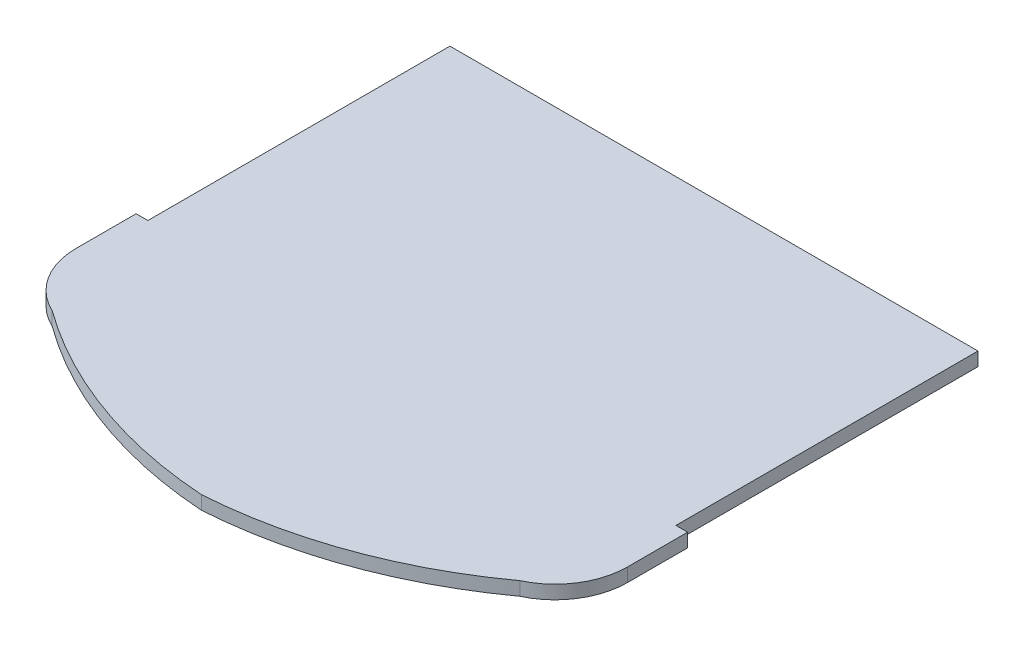
ISO-10303-21;
HEADER;
FILE_DESCRIPTION(('STEP AP214'),'2;1');
FILE_NAME('part.step','',(''),(''),'','','');
FILE_SCHEMA(('AUTOMOTIVE_DESIGN { 1 0 10303 214 1 1 1 1 }'));
ENDSEC;
DATA;
#1=APPLICATION_CONTEXT('core data for automotive mechanical design processes');
#2=APPLICATION_PROTOCOL_DEFINITION('international standard','automotive_design',2000,#1);
#3=PRODUCT_CONTEXT('',#1,'mechanical');
#4=PRODUCT('Part','Part','',(#3));
#5=PRODUCT_RELATED_PRODUCT_CATEGORY('part','',(#4));
#6=PRODUCT_DEFINITION_FORMATION('','',#4);
#7=PRODUCT_DEFINITION_CONTEXT('part definition',#1,'design');
#8=PRODUCT_DEFINITION('design','',#6,#7);
#9=PRODUCT_DEFINITION_SHAPE('','',#8);
#10=(LENGTH_UNIT() NAMED_UNIT(*) SI_UNIT(.MILLI.,.METRE.));
#11=(NAMED_UNIT(*) PLANE_ANGLE_UNIT() SI_UNIT($,.RADIAN.));
#12=(NAMED_UNIT(*) SI_UNIT($,.STERADIAN.) SOLID_ANGLE_UNIT());
#13=UNCERTAINTY_MEASURE_WITH_UNIT(LENGTH_MEASURE(1.E-05),#10,'distance_accuracy_value','');
#14=(GEOMETRIC_REPRESENTATION_CONTEXT(3) GLOBAL_UNCERTAINTY_ASSIGNED_CONTEXT((#13)) GLOBAL_UNIT_ASSIGNED_CONTEXT((#10,
#11,#12)) REPRESENTATION_CONTEXT('',''));
#15=CARTESIAN_POINT('',(0.,0.,0.));
#16=DIRECTION('',(0.,0.,1.));
#17=DIRECTION('',(1.,0.,0.));
#18=AXIS2_PLACEMENT_3D('',#15,#16,#17);
#19=CARTESIAN_POINT('',(464.2612,11.43,0.));
#20=DIRECTION('',(-1.,0.,0.));
#21=DIRECTION('',(0.,0.,1.));
#22=AXIS2_PLACEMENT_3D('',#19,#20,#21);
#23=PLANE('',#22);
#24=DIRECTION('',(0.,0.,-1.));
#25=VECTOR('',#24,1.);
#26=CARTESIAN_POINT('',(464.2612,-11.43,0.));
#27=LINE('',#26,#25);
#28=CARTESIAN_POINT('',(464.2612,-11.43,609.6));
#29=VERTEX_POINT('',#28);
#30=CARTESIAN_POINT('',(464.2612,-11.43,508.5588));
#31=VERTEX_POINT('',#30);
#32=EDGE_CURVE('E160',#29,#31,#27,.T.);
#33=ORIENTED_EDGE('',*,*,#32,.T.);
#34=DIRECTION('',(0.,-1.,0.));
#35=VECTOR('',#34,1.);
#36=CARTESIAN_POINT('',(464.2612,11.43,508.5588));
#37=LINE('',#36,#35);
#38=CARTESIAN_POINT('',(464.2612,11.43,508.5588));
#39=VERTEX_POINT('',#38);
#40=EDGE_CURVE('E11',#39,#31,#37,.T.);
#41=ORIENTED_EDGE('',*,*,#40,.F.);
#42=DIRECTION('',(0.,0.,-1.));
#43=VECTOR('',#42,1.);
#44=CARTESIAN_POINT('',(464.2612,11.43,0.));
#45=LINE('',#44,#43);
#46=CARTESIAN_POINT('',(464.2612,11.43,609.6));
#47=VERTEX_POINT('',#46);
#48=EDGE_CURVE('E185',#47,#39,#45,.T.);
#49=ORIENTED_EDGE('',*,*,#48,.F.);
#50=DIRECTION('',(0.,-1.,0.));
#51=VECTOR('',#50,1.);
#52=CARTESIAN_POINT('',(464.2612,11.43,609.6));
#53=LINE('',#52,#51);
#54=EDGE_CURVE('E156',#47,#29,#53,.T.);
#55=ORIENTED_EDGE('',*,*,#54,.T.);
#56=EDGE_LOOP('',(#33,#41,#49,#55));
#57=FACE_BOUND('',#56,.T.);
#58=ADVANCED_FACE('F45',(#57),#23,.F.);
#59=CARTESIAN_POINT('',(0.,11.43,508.5588));
#60=DIRECTION('',(0.,0.,1.));
#61=DIRECTION('',(1.,0.,0.));
#62=AXIS2_PLACEMENT_3D('',#59,#60,#61);
#63=PLANE('',#62);
#64=DIRECTION('',(-1.,0.,0.));
#65=VECTOR('',#64,1.);
#66=CARTESIAN_POINT('',(0.,-11.43,508.5588));
#67=LINE('',#66,#65);
#68=CARTESIAN_POINT('',(444.5,-11.43,508.5588));
#69=VERTEX_POINT('',#68);
#70=EDGE_CURVE('E163',#31,#69,#67,.T.);
#71=ORIENTED_EDGE('',*,*,#70,.T.);
#72=DIRECTION('',(0.,-1.,0.));
#73=VECTOR('',#72,1.);
#74=CARTESIAN_POINT('',(444.5,11.43,508.5588));
#75=LINE('',#74,#73);
#76=CARTESIAN_POINT('',(444.5,11.43,508.5588));
#77=VERTEX_POINT('',#76);
#78=EDGE_CURVE('E53',#77,#69,#75,.T.);
#79=ORIENTED_EDGE('',*,*,#78,.F.);
#80=DIRECTION('',(-1.,0.,0.));
#81=VECTOR('',#80,1.);
#82=CARTESIAN_POINT('',(0.,11.43,508.5588));
#83=LINE('',#82,#81);
#84=EDGE_CURVE('E113',#39,#77,#83,.T.);
#85=ORIENTED_EDGE('',*,*,#84,.F.);
#86=ORIENTED_EDGE('',*,*,#40,.T.);
#87=EDGE_LOOP('',(#71,#79,#85,#86));
#88=FACE_BOUND('',#87,.T.);
#89=ADVANCED_FACE('F205',(#88),#63,.F.);
#90=CARTESIAN_POINT('',(444.499999999999,11.43,-4.85722573273506E-13));
#91=DIRECTION('',(1.,0.,0.));
#92=DIRECTION('',(0.,0.,-1.));
#93=AXIS2_PLACEMENT_3D('',#90,#91,#92);
#94=PLANE('',#93);
#95=DIRECTION('',(0.,0.,1.));
#96=VECTOR('',#95,1.);
#97=CARTESIAN_POINT('',(444.499999999999,-11.43,-4.85722573273506E-13));
#98=LINE('',#97,#96);
#99=CARTESIAN_POINT('',(444.5,-11.43,1.11022302462516E-13));
#100=VERTEX_POINT('',#99);
#101=EDGE_CURVE('E166',#100,#69,#98,.T.);
#102=ORIENTED_EDGE('',*,*,#101,.F.);
#103=DIRECTION('',(0.,-1.,0.));
#104=VECTOR('',#103,1.);
#105=CARTESIAN_POINT('',(444.5,11.43,1.11022302462516E-13));
#106=LINE('',#105,#104);
#107=CARTESIAN_POINT('',(444.5,11.43,1.11022302462516E-13));
#108=VERTEX_POINT('',#107);
#109=EDGE_CURVE('E198',#108,#100,#106,.T.);
#110=ORIENTED_EDGE('',*,*,#109,.F.);
#111=DIRECTION('',(0.,0.,1.));
#112=VECTOR('',#111,1.);
#113=CARTESIAN_POINT('',(444.499999999999,11.43,-4.85722573273506E-13));
#114=LINE('',#113,#112);
#115=EDGE_CURVE('E204',#108,#77,#114,.T.);
#116=ORIENTED_EDGE('',*,*,#115,.T.);
#117=ORIENTED_EDGE('',*,*,#78,.T.);
#118=EDGE_LOOP('',(#102,#110,#116,#117));
#119=FACE_BOUND('',#118,.T.);
#120=ADVANCED_FACE('F202',(#119),#94,.T.);
#121=CARTESIAN_POINT('',(0.,11.43,0.));
#122=DIRECTION('',(0.,0.,1.));
#123=DIRECTION('',(1.,0.,0.));
#124=AXIS2_PLACEMENT_3D('',#121,#122,#123);
#125=PLANE('',#124);
#126=DIRECTION('',(-1.,0.,0.));
#127=VECTOR('',#126,1.);
#128=CARTESIAN_POINT('',(0.,-11.43,0.));
#129=LINE('',#128,#127);
#130=CARTESIAN_POINT('',(-444.5,-11.43,0.));
#131=VERTEX_POINT('',#130);
#132=EDGE_CURVE('E169',#100,#131,#129,.T.);
#133=ORIENTED_EDGE('',*,*,#132,.T.);
#134=DIRECTION('',(0.,-1.,0.));
#135=VECTOR('',#134,1.);
#136=CARTESIAN_POINT('',(-444.5,11.43,0.));
#137=LINE('',#136,#135);
#138=CARTESIAN_POINT('',(-444.5,11.43,0.));
#139=VERTEX_POINT('',#138);
#140=EDGE_CURVE('E195',#139,#131,#137,.T.);
#141=ORIENTED_EDGE('',*,*,#140,.F.);
#142=DIRECTION('',(-1.,0.,0.));
#143=VECTOR('',#142,1.);
#144=CARTESIAN_POINT('',(0.,11.43,0.));
#145=LINE('',#144,#143);
#146=EDGE_CURVE('E224',#108,#139,#145,.T.);
#147=ORIENTED_EDGE('',*,*,#146,.F.);
#148=ORIENTED_EDGE('',*,*,#109,.T.);
#149=EDGE_LOOP('',(#133,#141,#147,#148));
#150=FACE_BOUND('',#149,.T.);
#151=ADVANCED_FACE('F214',(#150),#125,.F.);
#152=CARTESIAN_POINT('',(-444.5,11.43,2.20782987851594E-13));
#153=DIRECTION('',(1.,0.,0.));
#154=DIRECTION('',(0.,0.,-1.));
#155=AXIS2_PLACEMENT_3D('',#152,#153,#154);
#156=PLANE('',#155);
#157=DIRECTION('',(0.,0.,1.));
#158=VECTOR('',#157,1.);
#159=CARTESIAN_POINT('',(-444.5,-11.43,2.20782987851594E-13));
#160=LINE('',#159,#158);
#161=CARTESIAN_POINT('',(-444.5,-11.43,508.5588));
#162=VERTEX_POINT('',#161);
#163=EDGE_CURVE('E171',#131,#162,#160,.T.);
#164=ORIENTED_EDGE('',*,*,#163,.T.);
#165=DIRECTION('',(0.,-1.,0.));
#166=VECTOR('',#165,1.);
#167=CARTESIAN_POINT('',(-444.5,11.43,508.5588));
#168=LINE('',#167,#166);
#169=CARTESIAN_POINT('',(-444.5,11.43,508.5588));
#170=VERTEX_POINT('',#169);
#171=EDGE_CURVE('E193',#170,#162,#168,.T.);
#172=ORIENTED_EDGE('',*,*,#171,.F.);
#173=DIRECTION('',(0.,0.,1.));
#174=VECTOR('',#173,1.);
#175=CARTESIAN_POINT('',(-444.5,11.43,2.20782987851594E-13));
#176=LINE('',#175,#174);
#177=EDGE_CURVE('E220',#139,#170,#176,.T.);
#178=ORIENTED_EDGE('',*,*,#177,.F.);
#179=ORIENTED_EDGE('',*,*,#140,.T.);
#180=EDGE_LOOP('',(#164,#172,#178,#179));
#181=FACE_BOUND('',#180,.T.);
#182=ADVANCED_FACE('F218',(#181),#156,.F.);
#183=CARTESIAN_POINT('',(0.,11.43,508.5588));
#184=DIRECTION('',(0.,0.,-1.));
#185=DIRECTION('',(-1.,0.,0.));
#186=AXIS2_PLACEMENT_3D('',#183,#184,#185);
#187=PLANE('',#186);
#188=DIRECTION('',(1.,0.,0.));
#189=VECTOR('',#188,1.);
#190=CARTESIAN_POINT('',(0.,-11.43,508.5588));
#191=LINE('',#190,#189);
#192=CARTESIAN_POINT('',(-464.2612,-11.43,508.5588));
#193=VERTEX_POINT('',#192);
#194=EDGE_CURVE('E174',#193,#162,#191,.T.);
#195=ORIENTED_EDGE('',*,*,#194,.F.);
#196=DIRECTION('',(0.,-1.,0.));
#197=VECTOR('',#196,1.);
#198=CARTESIAN_POINT('',(-464.2612,11.43,508.5588));
#199=LINE('',#198,#197);
#200=CARTESIAN_POINT('',(-464.2612,11.43,508.5588));
#201=VERTEX_POINT('',#200);
#202=EDGE_CURVE('E191',#201,#193,#199,.T.);
#203=ORIENTED_EDGE('',*,*,#202,.F.);
#204=DIRECTION('',(1.,0.,0.));
#205=VECTOR('',#204,1.);
#206=CARTESIAN_POINT('',(0.,11.43,508.5588));
#207=LINE('',#206,#205);
#208=EDGE_CURVE('E223',#201,#170,#207,.T.);
#209=ORIENTED_EDGE('',*,*,#208,.T.);
#210=ORIENTED_EDGE('',*,*,#171,.T.);
#211=EDGE_LOOP('',(#195,#203,#209,#210));
#212=FACE_BOUND('',#211,.T.);
#213=ADVANCED_FACE('F237',(#212),#187,.T.);
#214=CARTESIAN_POINT('',(-464.2612,11.43,0.));
#215=DIRECTION('',(-1.,0.,0.));
#216=DIRECTION('',(0.,0.,1.));
#217=AXIS2_PLACEMENT_3D('',#214,#215,#216);
#218=PLANE('',#217);
#219=DIRECTION('',(0.,0.,-1.));
#220=VECTOR('',#219,1.);
#221=CARTESIAN_POINT('',(-464.2612,-11.43,0.));
#222=LINE('',#221,#220);
#223=CARTESIAN_POINT('',(-464.2612,-11.43,609.6));
#224=VERTEX_POINT('',#223);
#225=EDGE_CURVE('E177',#224,#193,#222,.T.);
#226=ORIENTED_EDGE('',*,*,#225,.F.);
#227=DIRECTION('',(0.,-1.,0.));
#228=VECTOR('',#227,1.);
#229=CARTESIAN_POINT('',(-464.2612,11.43,609.6));
#230=LINE('',#229,#228);
#231=CARTESIAN_POINT('',(-464.2612,11.43,609.6));
#232=VERTEX_POINT('',#231);
#233=EDGE_CURVE('E189',#232,#224,#230,.T.);
#234=ORIENTED_EDGE('',*,*,#233,.F.);
#235=DIRECTION('',(0.,0.,-1.));
#236=VECTOR('',#235,1.);
#237=CARTESIAN_POINT('',(-464.2612,11.43,0.));
#238=LINE('',#237,#236);
#239=EDGE_CURVE('E226',#232,#201,#238,.T.);
#240=ORIENTED_EDGE('',*,*,#239,.T.);
#241=ORIENTED_EDGE('',*,*,#202,.T.);
#242=EDGE_LOOP('',(#226,#234,#240,#241));
#243=FACE_BOUND('',#242,.T.);
#244=ADVANCED_FACE('F234',(#243),#218,.T.);
#245=CARTESIAN_POINT('',(-342.012309747812,11.43,609.6));
#246=DIRECTION('',(0.,-1.,0.));
#247=DIRECTION('',(0.,0.,-1.));
#248=AXIS2_PLACEMENT_3D('',#245,#246,#247);
#249=CYLINDRICAL_SURFACE('',#248,122.248890252189);
#250=CARTESIAN_POINT('',(-342.012309747812,-11.43,609.6));
#251=DIRECTION('',(0.,1.,0.));
#252=DIRECTION('',(0.,0.,1.));
#253=AXIS2_PLACEMENT_3D('',#250,#251,#252);
#254=CIRCLE('',#253,122.248890252189);
#255=CARTESIAN_POINT('',(-393.602166775727,-11.43,720.429950012309));
#256=VERTEX_POINT('',#255);
#257=EDGE_CURVE('E180',#224,#256,#254,.T.);
#258=ORIENTED_EDGE('',*,*,#257,.T.);
#259=DIRECTION('',(0.,-1.,0.));
#260=VECTOR('',#259,1.);
#261=CARTESIAN_POINT('',(-393.602166775727,11.43,720.429950012309));
#262=LINE('',#261,#260);
#263=CARTESIAN_POINT('',(-393.602166775727,11.43,720.429950012309));
#264=VERTEX_POINT('',#263);
#265=EDGE_CURVE('E151',#264,#256,#262,.T.);
#266=ORIENTED_EDGE('',*,*,#265,.F.);
#267=CARTESIAN_POINT('',(-342.012309747812,11.43,609.6));
#268=DIRECTION('',(0.,1.,0.));
#269=DIRECTION('',(0.,0.,1.));
#270=AXIS2_PLACEMENT_3D('',#267,#268,#269);
#271=CIRCLE('',#270,122.248890252189);
#272=EDGE_CURVE('E142',#232,#264,#271,.T.);
#273=ORIENTED_EDGE('',*,*,#272,.F.);
#274=ORIENTED_EDGE('',*,*,#233,.T.);
#275=EDGE_LOOP('',(#258,#266,#273,#274));
#276=FACE_BOUND('',#275,.T.);
#277=ADVANCED_FACE('F240',(#276),#249,.T.);
#278=CARTESIAN_POINT('',(49.5153130740444,11.43,111.904371744927));
#279=DIRECTION('',(0.,-1.,0.));
#280=DIRECTION('',(0.,0.,-1.));
#281=AXIS2_PLACEMENT_3D('',#278,#279,#280);
#282=CYLINDRICAL_SURFACE('',#281,752.765886816123);
#283=CARTESIAN_POINT('',(49.5153130740444,-11.43,111.904371744927));
#284=DIRECTION('',(0.,1.,0.));
#285=DIRECTION('',(0.,0.,1.));
#286=AXIS2_PLACEMENT_3D('',#283,#284,#285);
#287=CIRCLE('',#286,752.765886816123);
#288=CARTESIAN_POINT('',(-1.66533453693773E-13,-11.43,863.039988078784));
#289=VERTEX_POINT('',#288);
#290=EDGE_CURVE('E150',#256,#289,#287,.T.);
#291=ORIENTED_EDGE('',*,*,#290,.T.);
#292=DIRECTION('',(0.,-1.,0.));
#293=VECTOR('',#292,1.);
#294=CARTESIAN_POINT('',(-1.66533453693773E-13,11.43,863.039988078784));
#295=LINE('',#294,#293);
#296=CARTESIAN_POINT('',(-1.66533453693773E-13,11.43,863.039988078784));
#297=VERTEX_POINT('',#296);
#298=EDGE_CURVE('E147',#297,#289,#295,.T.);
#299=ORIENTED_EDGE('',*,*,#298,.F.);
#300=CARTESIAN_POINT('',(49.5153130740444,11.43,111.904371744927));
#301=DIRECTION('',(0.,1.,0.));
#302=DIRECTION('',(0.,0.,1.));
#303=AXIS2_PLACEMENT_3D('',#300,#301,#302);
#304=CIRCLE('',#303,752.765886816123);
#305=EDGE_CURVE('E135',#264,#297,#304,.T.);
#306=ORIENTED_EDGE('',*,*,#305,.F.);
#307=ORIENTED_EDGE('',*,*,#265,.T.);
#308=EDGE_LOOP('',(#291,#299,#306,#307));
#309=FACE_BOUND('',#308,.T.);
#310=ADVANCED_FACE('F148',(#309),#282,.T.);
#311=CARTESIAN_POINT('',(-49.5153130740444,11.43,111.904371744927));
#312=DIRECTION('',(0.,-1.,0.));
#313=DIRECTION('',(0.,0.,-1.));
#314=AXIS2_PLACEMENT_3D('',#311,#312,#313);
#315=CYLINDRICAL_SURFACE('',#314,752.765886816123);
#316=CARTESIAN_POINT('',(-49.5153130740444,-11.43,111.904371744927));
#317=DIRECTION('',(0.,1.,0.));
#318=DIRECTION('',(0.,0.,1.));
#319=AXIS2_PLACEMENT_3D('',#316,#317,#318);
#320=CIRCLE('',#319,752.765886816123);
#321=CARTESIAN_POINT('',(393.602166775727,-11.43,720.429950012309));
#322=VERTEX_POINT('',#321);
#323=EDGE_CURVE('E99',#289,#322,#320,.T.);
#324=ORIENTED_EDGE('',*,*,#323,.T.);
#325=DIRECTION('',(0.,-1.,0.));
#326=VECTOR('',#325,1.);
#327=CARTESIAN_POINT('',(393.602166775727,11.43,720.429950012309));
#328=LINE('',#327,#326);
#329=CARTESIAN_POINT('',(393.602166775727,11.43,720.429950012309));
#330=VERTEX_POINT('',#329);
#331=EDGE_CURVE('E152',#330,#322,#328,.T.);
#332=ORIENTED_EDGE('',*,*,#331,.F.);
#333=CARTESIAN_POINT('',(-49.5153130740444,11.43,111.904371744927));
#334=DIRECTION('',(0.,1.,0.));
#335=DIRECTION('',(0.,0.,1.));
#336=AXIS2_PLACEMENT_3D('',#333,#334,#335);
#337=CIRCLE('',#336,752.765886816123);
#338=EDGE_CURVE('E139',#297,#330,#337,.T.);
#339=ORIENTED_EDGE('',*,*,#338,.F.);
#340=ORIENTED_EDGE('',*,*,#298,.T.);
#341=EDGE_LOOP('',(#324,#332,#339,#340));
#342=FACE_BOUND('',#341,.T.);
#343=ADVANCED_FACE('F154',(#342),#315,.T.);
#344=CARTESIAN_POINT('',(342.012309747812,11.43,609.6));
#345=DIRECTION('',(0.,-1.,0.));
#346=DIRECTION('',(0.,0.,-1.));
#347=AXIS2_PLACEMENT_3D('',#344,#345,#346);
#348=CYLINDRICAL_SURFACE('',#347,122.248890252189);
#349=CARTESIAN_POINT('',(342.012309747812,-11.43,609.6));
#350=DIRECTION('',(0.,1.,0.));
#351=DIRECTION('',(0.,0.,1.));
#352=AXIS2_PLACEMENT_3D('',#349,#350,#351);
#353=CIRCLE('',#352,122.248890252189);
#354=EDGE_CURVE('E105',#322,#29,#353,.T.);
#355=ORIENTED_EDGE('',*,*,#354,.T.);
#356=ORIENTED_EDGE('',*,*,#54,.F.);
#357=CARTESIAN_POINT('',(342.012309747812,11.43,609.6));
#358=DIRECTION('',(0.,1.,0.));
#359=DIRECTION('',(0.,0.,1.));
#360=AXIS2_PLACEMENT_3D('',#357,#358,#359);
#361=CIRCLE('',#360,122.248890252189);
#362=EDGE_CURVE('E61',#330,#47,#361,.T.);
#363=ORIENTED_EDGE('',*,*,#362,.F.);
#364=ORIENTED_EDGE('',*,*,#331,.T.);
#365=EDGE_LOOP('',(#355,#356,#363,#364));
#366=FACE_BOUND('',#365,.T.);
#367=ADVANCED_FACE('F255',(#366),#348,.T.);
#368=CARTESIAN_POINT('',(0.,11.43,0.));
#369=DIRECTION('',(0.,1.,0.));
#370=DIRECTION('',(0.,0.,1.));
#371=AXIS2_PLACEMENT_3D('',#368,#369,#370);
#372=PLANE('',#371);
#373=ORIENTED_EDGE('',*,*,#48,.T.);
#374=ORIENTED_EDGE('',*,*,#84,.T.);
#375=ORIENTED_EDGE('',*,*,#115,.F.);
#376=ORIENTED_EDGE('',*,*,#146,.T.);
#377=ORIENTED_EDGE('',*,*,#177,.T.);
#378=ORIENTED_EDGE('',*,*,#208,.F.);
#379=ORIENTED_EDGE('',*,*,#239,.F.);
#380=ORIENTED_EDGE('',*,*,#272,.T.);
#381=ORIENTED_EDGE('',*,*,#305,.T.);
#382=ORIENTED_EDGE('',*,*,#338,.T.);
#383=ORIENTED_EDGE('',*,*,#362,.T.);
#384=EDGE_LOOP('',(#373,#374,#375,#376,#377,#378,#379,#380,#381,#382,#383));
#385=FACE_BOUND('',#384,.T.);
#386=ADVANCED_FACE('F137',(#385),#372,.T.);
#387=CARTESIAN_POINT('',(0.,-11.43,0.));
#388=DIRECTION('',(0.,1.,0.));
#389=DIRECTION('',(0.,0.,1.));
#390=AXIS2_PLACEMENT_3D('',#387,#388,#389);
#391=PLANE('',#390);
#392=ORIENTED_EDGE('',*,*,#32,.F.);
#393=ORIENTED_EDGE('',*,*,#354,.F.);
#394=ORIENTED_EDGE('',*,*,#323,.F.);
#395=ORIENTED_EDGE('',*,*,#290,.F.);
#396=ORIENTED_EDGE('',*,*,#257,.F.);
#397=ORIENTED_EDGE('',*,*,#225,.T.);
#398=ORIENTED_EDGE('',*,*,#194,.T.);
#399=ORIENTED_EDGE('',*,*,#163,.F.);
#400=ORIENTED_EDGE('',*,*,#132,.F.);
#401=ORIENTED_EDGE('',*,*,#101,.T.);
#402=ORIENTED_EDGE('',*,*,#70,.F.);
#403=EDGE_LOOP('',(#392,#393,#394,#395,#396,#397,#398,#399,#400,#401,#402));
#404=FACE_BOUND('',#403,.T.);
#405=ADVANCED_FACE('F210',(#404),#391,.F.);
#406=CLOSED_SHELL('',(#58,#89,#120,#151,#182,#213,#244,#277,#310,#343,#367,#386,#405));
#407=MANIFOLD_SOLID_BREP('B2',#406);
#408=ADVANCED_BREP_SHAPE_REPRESENTATION('',(#18,#407),#14);
#409=SHAPE_DEFINITION_REPRESENTATION(#9,#408);
ENDSEC;
END-ISO-10303-21;
